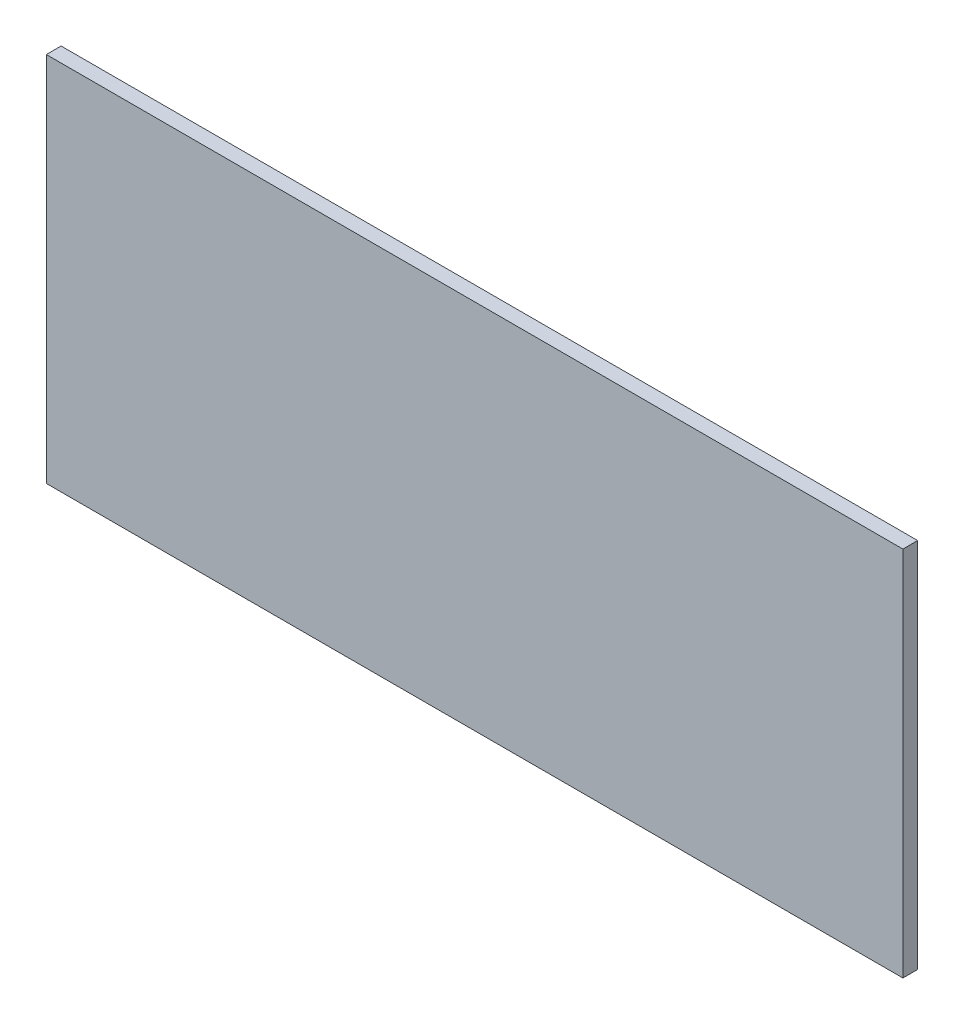
ISO-10303-21;
HEADER;
FILE_DESCRIPTION(('STEP AP214'),'2;1');
FILE_NAME('part.step','',(''),(''),'','','');
FILE_SCHEMA(('AUTOMOTIVE_DESIGN { 1 0 10303 214 1 1 1 1 }'));
ENDSEC;
DATA;
#1=APPLICATION_CONTEXT('core data for automotive mechanical design processes');
#2=APPLICATION_PROTOCOL_DEFINITION('international standard','automotive_design',2000,#1);
#3=PRODUCT_CONTEXT('',#1,'mechanical');
#4=PRODUCT('Part','Part','',(#3));
#5=PRODUCT_RELATED_PRODUCT_CATEGORY('part','',(#4));
#6=PRODUCT_DEFINITION_FORMATION('','',#4);
#7=PRODUCT_DEFINITION_CONTEXT('part definition',#1,'design');
#8=PRODUCT_DEFINITION('design','',#6,#7);
#9=PRODUCT_DEFINITION_SHAPE('','',#8);
#10=(LENGTH_UNIT() NAMED_UNIT(*) SI_UNIT(.MILLI.,.METRE.));
#11=(NAMED_UNIT(*) PLANE_ANGLE_UNIT() SI_UNIT($,.RADIAN.));
#12=(NAMED_UNIT(*) SI_UNIT($,.STERADIAN.) SOLID_ANGLE_UNIT());
#13=UNCERTAINTY_MEASURE_WITH_UNIT(LENGTH_MEASURE(1.E-05),#10,'distance_accuracy_value','');
#14=(GEOMETRIC_REPRESENTATION_CONTEXT(3) GLOBAL_UNCERTAINTY_ASSIGNED_CONTEXT((#13)) GLOBAL_UNIT_ASSIGNED_CONTEXT((#10,
#11,#12)) REPRESENTATION_CONTEXT('',''));
#15=CARTESIAN_POINT('',(0.,0.,0.));
#16=DIRECTION('',(0.,0.,1.));
#17=DIRECTION('',(1.,0.,0.));
#18=AXIS2_PLACEMENT_3D('',#15,#16,#17);
#19=CARTESIAN_POINT('',(-208.467139929743,50.3303571428571,6.5));
#20=DIRECTION('',(1.,0.,0.));
#21=DIRECTION('',(0.,0.,-1.));
#22=AXIS2_PLACEMENT_3D('',#19,#20,#21);
#23=PLANE('',#22);
#24=DIRECTION('',(0.,-1.,0.));
#25=VECTOR('',#24,1.);
#26=CARTESIAN_POINT('',(-208.467139929743,50.3303571428571,0.));
#27=LINE('',#26,#25);
#28=CARTESIAN_POINT('',(-208.467139929743,50.3303571428571,0.));
#29=VERTEX_POINT('',#28);
#30=CARTESIAN_POINT('',(-208.467139929743,-113.169642857143,0.));
#31=VERTEX_POINT('',#30);
#32=EDGE_CURVE('E102',#29,#31,#27,.T.);
#33=ORIENTED_EDGE('',*,*,#32,.T.);
#34=DIRECTION('',(0.,0.,-1.));
#35=VECTOR('',#34,1.);
#36=CARTESIAN_POINT('',(-208.467139929743,-113.169642857143,6.5));
#37=LINE('',#36,#35);
#38=CARTESIAN_POINT('',(-208.467139929743,-113.169642857143,6.5));
#39=VERTEX_POINT('',#38);
#40=EDGE_CURVE('E11',#39,#31,#37,.T.);
#41=ORIENTED_EDGE('',*,*,#40,.F.);
#42=DIRECTION('',(0.,-1.,0.));
#43=VECTOR('',#42,1.);
#44=CARTESIAN_POINT('',(-208.467139929743,50.3303571428571,6.5));
#45=LINE('',#44,#43);
#46=CARTESIAN_POINT('',(-208.467139929743,50.3303571428571,6.5));
#47=VERTEX_POINT('',#46);
#48=EDGE_CURVE('E88',#47,#39,#45,.T.);
#49=ORIENTED_EDGE('',*,*,#48,.F.);
#50=DIRECTION('',(0.,0.,-1.));
#51=VECTOR('',#50,1.);
#52=CARTESIAN_POINT('',(-208.467139929743,50.3303571428571,6.5));
#53=LINE('',#52,#51);
#54=EDGE_CURVE('E98',#47,#29,#53,.T.);
#55=ORIENTED_EDGE('',*,*,#54,.T.);
#56=EDGE_LOOP('',(#33,#41,#49,#55));
#57=FACE_BOUND('',#56,.T.);
#58=ADVANCED_FACE('F37',(#57),#23,.F.);
#59=CARTESIAN_POINT('',(-208.467139929743,-113.169642857143,6.5));
#60=DIRECTION('',(0.,1.,0.));
#61=DIRECTION('',(0.,0.,1.));
#62=AXIS2_PLACEMENT_3D('',#59,#60,#61);
#63=PLANE('',#62);
#64=DIRECTION('',(1.,0.,0.));
#65=VECTOR('',#64,1.);
#66=CARTESIAN_POINT('',(-208.467139929743,-113.169642857143,0.));
#67=LINE('',#66,#65);
#68=CARTESIAN_POINT('',(168.532860070257,-113.169642857143,0.));
#69=VERTEX_POINT('',#68);
#70=EDGE_CURVE('E92',#31,#69,#67,.T.);
#71=ORIENTED_EDGE('',*,*,#70,.T.);
#72=DIRECTION('',(0.,0.,-1.));
#73=VECTOR('',#72,1.);
#74=CARTESIAN_POINT('',(168.532860070257,-113.169642857143,6.5));
#75=LINE('',#74,#73);
#76=CARTESIAN_POINT('',(168.532860070257,-113.169642857143,6.5));
#77=VERTEX_POINT('',#76);
#78=EDGE_CURVE('E45',#77,#69,#75,.T.);
#79=ORIENTED_EDGE('',*,*,#78,.F.);
#80=DIRECTION('',(1.,0.,0.));
#81=VECTOR('',#80,1.);
#82=CARTESIAN_POINT('',(-208.467139929743,-113.169642857143,6.5));
#83=LINE('',#82,#81);
#84=EDGE_CURVE('E83',#39,#77,#83,.T.);
#85=ORIENTED_EDGE('',*,*,#84,.F.);
#86=ORIENTED_EDGE('',*,*,#40,.T.);
#87=EDGE_LOOP('',(#71,#79,#85,#86));
#88=FACE_BOUND('',#87,.T.);
#89=ADVANCED_FACE('F91',(#88),#63,.F.);
#90=CARTESIAN_POINT('',(168.532860070257,50.3303571428571,6.5));
#91=DIRECTION('',(-1.,0.,0.));
#92=DIRECTION('',(0.,0.,1.));
#93=AXIS2_PLACEMENT_3D('',#90,#91,#92);
#94=PLANE('',#93);
#95=DIRECTION('',(0.,1.,0.));
#96=VECTOR('',#95,1.);
#97=CARTESIAN_POINT('',(168.532860070257,50.3303571428571,0.));
#98=LINE('',#97,#96);
#99=CARTESIAN_POINT('',(168.532860070257,50.3303571428571,0.));
#100=VERTEX_POINT('',#99);
#101=EDGE_CURVE('E70',#69,#100,#98,.T.);
#102=ORIENTED_EDGE('',*,*,#101,.T.);
#103=DIRECTION('',(0.,0.,-1.));
#104=VECTOR('',#103,1.);
#105=CARTESIAN_POINT('',(168.532860070257,50.3303571428571,6.5));
#106=LINE('',#105,#104);
#107=CARTESIAN_POINT('',(168.532860070257,50.3303571428571,6.5));
#108=VERTEX_POINT('',#107);
#109=EDGE_CURVE('E93',#108,#100,#106,.T.);
#110=ORIENTED_EDGE('',*,*,#109,.F.);
#111=DIRECTION('',(0.,1.,0.));
#112=VECTOR('',#111,1.);
#113=CARTESIAN_POINT('',(168.532860070257,50.3303571428571,6.5));
#114=LINE('',#113,#112);
#115=EDGE_CURVE('E86',#77,#108,#114,.T.);
#116=ORIENTED_EDGE('',*,*,#115,.F.);
#117=ORIENTED_EDGE('',*,*,#78,.T.);
#118=EDGE_LOOP('',(#102,#110,#116,#117));
#119=FACE_BOUND('',#118,.T.);
#120=ADVANCED_FACE('F94',(#119),#94,.F.);
#121=CARTESIAN_POINT('',(-208.467139929743,50.3303571428571,6.5));
#122=DIRECTION('',(0.,-1.,0.));
#123=DIRECTION('',(0.,0.,-1.));
#124=AXIS2_PLACEMENT_3D('',#121,#122,#123);
#125=PLANE('',#124);
#126=DIRECTION('',(-1.,0.,0.));
#127=VECTOR('',#126,1.);
#128=CARTESIAN_POINT('',(-208.467139929743,50.3303571428571,0.));
#129=LINE('',#128,#127);
#130=EDGE_CURVE('E76',#100,#29,#129,.T.);
#131=ORIENTED_EDGE('',*,*,#130,.T.);
#132=ORIENTED_EDGE('',*,*,#54,.F.);
#133=DIRECTION('',(-1.,0.,0.));
#134=VECTOR('',#133,1.);
#135=CARTESIAN_POINT('',(-208.467139929743,50.3303571428571,6.5));
#136=LINE('',#135,#134);
#137=EDGE_CURVE('E53',#108,#47,#136,.T.);
#138=ORIENTED_EDGE('',*,*,#137,.F.);
#139=ORIENTED_EDGE('',*,*,#109,.T.);
#140=EDGE_LOOP('',(#131,#132,#138,#139));
#141=FACE_BOUND('',#140,.T.);
#142=ADVANCED_FACE('F109',(#141),#125,.F.);
#143=CARTESIAN_POINT('',(0.,0.,6.5));
#144=DIRECTION('',(0.,0.,1.));
#145=DIRECTION('',(1.,0.,0.));
#146=AXIS2_PLACEMENT_3D('',#143,#144,#145);
#147=PLANE('',#146);
#148=ORIENTED_EDGE('',*,*,#48,.T.);
#149=ORIENTED_EDGE('',*,*,#84,.T.);
#150=ORIENTED_EDGE('',*,*,#115,.T.);
#151=ORIENTED_EDGE('',*,*,#137,.T.);
#152=EDGE_LOOP('',(#148,#149,#150,#151));
#153=FACE_BOUND('',#152,.T.);
#154=ADVANCED_FACE('F84',(#153),#147,.T.);
#155=CARTESIAN_POINT('',(0.,0.,0.));
#156=DIRECTION('',(0.,0.,1.));
#157=DIRECTION('',(1.,0.,0.));
#158=AXIS2_PLACEMENT_3D('',#155,#156,#157);
#159=PLANE('',#158);
#160=ORIENTED_EDGE('',*,*,#32,.F.);
#161=ORIENTED_EDGE('',*,*,#130,.F.);
#162=ORIENTED_EDGE('',*,*,#101,.F.);
#163=ORIENTED_EDGE('',*,*,#70,.F.);
#164=EDGE_LOOP('',(#160,#161,#162,#163));
#165=FACE_BOUND('',#164,.T.);
#166=ADVANCED_FACE('F112',(#165),#159,.F.);
#167=CLOSED_SHELL('',(#58,#89,#120,#142,#154,#166));
#168=MANIFOLD_SOLID_BREP('B2',#167);
#169=ADVANCED_BREP_SHAPE_REPRESENTATION('',(#18,#168),#14);
#170=SHAPE_DEFINITION_REPRESENTATION(#9,#169);
ENDSEC;
END-ISO-10303-21;
